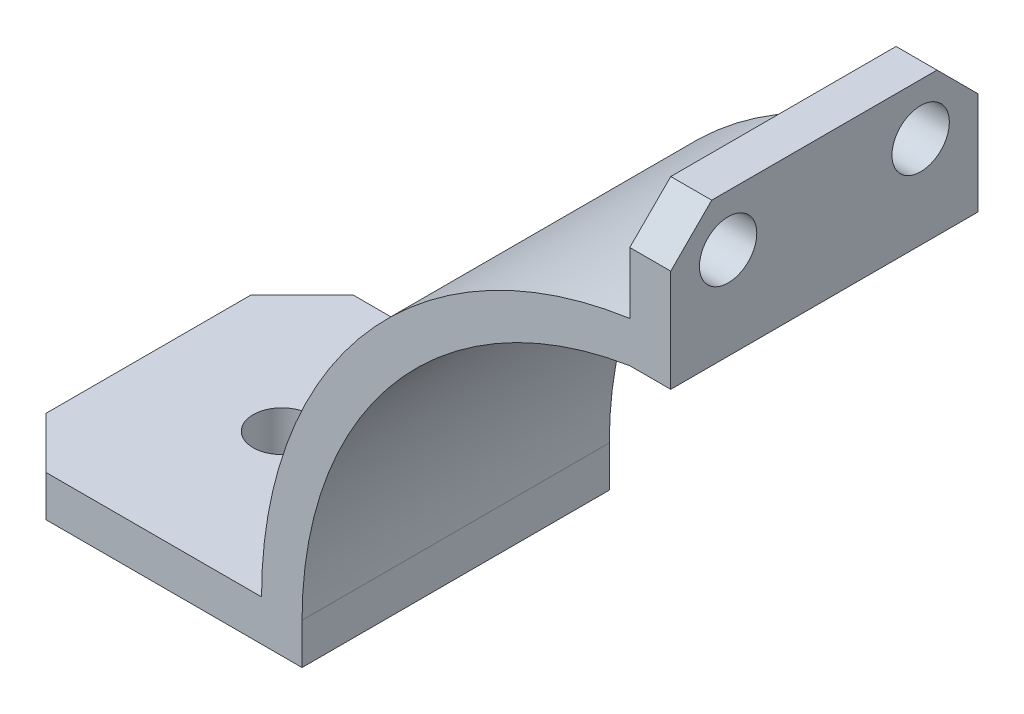
ISO-10303-21;
HEADER;
FILE_DESCRIPTION(('STEP AP214'),'2;1');
FILE_NAME('part.step','',(''),(''),'','','');
FILE_SCHEMA(('AUTOMOTIVE_DESIGN { 1 0 10303 214 1 1 1 1 }'));
ENDSEC;
DATA;
#1=APPLICATION_CONTEXT('core data for automotive mechanical design processes');
#2=APPLICATION_PROTOCOL_DEFINITION('international standard','automotive_design',2000,#1);
#3=PRODUCT_CONTEXT('',#1,'mechanical');
#4=PRODUCT('Part','Part','',(#3));
#5=PRODUCT_RELATED_PRODUCT_CATEGORY('part','',(#4));
#6=PRODUCT_DEFINITION_FORMATION('','',#4);
#7=PRODUCT_DEFINITION_CONTEXT('part definition',#1,'design');
#8=PRODUCT_DEFINITION('design','',#6,#7);
#9=PRODUCT_DEFINITION_SHAPE('','',#8);
#10=(LENGTH_UNIT() NAMED_UNIT(*) SI_UNIT(.MILLI.,.METRE.));
#11=(NAMED_UNIT(*) PLANE_ANGLE_UNIT() SI_UNIT($,.RADIAN.));
#12=(NAMED_UNIT(*) SI_UNIT($,.STERADIAN.) SOLID_ANGLE_UNIT());
#13=UNCERTAINTY_MEASURE_WITH_UNIT(LENGTH_MEASURE(1.E-05),#10,'distance_accuracy_value','');
#14=(GEOMETRIC_REPRESENTATION_CONTEXT(3) GLOBAL_UNCERTAINTY_ASSIGNED_CONTEXT((#13)) GLOBAL_UNIT_ASSIGNED_CONTEXT((#10,
#11,#12)) REPRESENTATION_CONTEXT('',''));
#15=CARTESIAN_POINT('',(0.,0.,0.));
#16=DIRECTION('',(0.,0.,1.));
#17=DIRECTION('',(1.,0.,0.));
#18=AXIS2_PLACEMENT_3D('',#15,#16,#17);
#19=CARTESIAN_POINT('',(0.,0.,15.));
#20=DIRECTION('',(0.,0.,-1.));
#21=DIRECTION('',(-1.,0.,0.));
#22=AXIS2_PLACEMENT_3D('',#19,#20,#21);
#23=CYLINDRICAL_SURFACE('',#22,19.);
#24=CARTESIAN_POINT('',(0.,0.,0.));
#25=DIRECTION('',(0.,0.,-1.));
#26=DIRECTION('',(-1.,0.,0.));
#27=AXIS2_PLACEMENT_3D('',#24,#25,#26);
#28=CIRCLE('',#27,19.);
#29=CARTESIAN_POINT('',(-19.,0.,0.));
#30=VERTEX_POINT('',#29);
#31=CARTESIAN_POINT('',(-3.,18.7616630392937,0.));
#32=VERTEX_POINT('',#31);
#33=EDGE_CURVE('E172',#30,#32,#28,.T.);
#34=ORIENTED_EDGE('',*,*,#33,.T.);
#35=DIRECTION('',(0.,0.,-1.));
#36=VECTOR('',#35,1.);
#37=CARTESIAN_POINT('',(-3.,18.7616630392937,15.));
#38=LINE('',#37,#36);
#39=CARTESIAN_POINT('',(-3.,18.7616630392937,15.));
#40=VERTEX_POINT('',#39);
#41=EDGE_CURVE('E152',#40,#32,#38,.T.);
#42=ORIENTED_EDGE('',*,*,#41,.F.);
#43=CARTESIAN_POINT('',(0.,0.,15.));
#44=DIRECTION('',(0.,0.,-1.));
#45=DIRECTION('',(-1.,0.,0.));
#46=AXIS2_PLACEMENT_3D('',#43,#44,#45);
#47=CIRCLE('',#46,19.);
#48=CARTESIAN_POINT('',(-19.,0.,15.));
#49=VERTEX_POINT('',#48);
#50=EDGE_CURVE('E160',#49,#40,#47,.T.);
#51=ORIENTED_EDGE('',*,*,#50,.F.);
#52=DIRECTION('',(0.,0.,-1.));
#53=VECTOR('',#52,1.);
#54=CARTESIAN_POINT('',(-19.,0.,15.));
#55=LINE('',#54,#53);
#56=EDGE_CURVE('E243',#49,#30,#55,.T.);
#57=ORIENTED_EDGE('',*,*,#56,.T.);
#58=EDGE_LOOP('',(#34,#42,#51,#57));
#59=FACE_BOUND('',#58,.T.);
#60=ADVANCED_FACE('F45',(#59),#23,.F.);
#61=CARTESIAN_POINT('',(-1.,18.7616630392937,15.));
#62=DIRECTION('',(0.,1.,0.));
#63=DIRECTION('',(0.,0.,1.));
#64=AXIS2_PLACEMENT_3D('',#61,#62,#63);
#65=PLANE('',#64);
#66=DIRECTION('',(1.,0.,0.));
#67=VECTOR('',#66,1.);
#68=CARTESIAN_POINT('',(-1.,18.7616630392937,0.));
#69=LINE('',#68,#67);
#70=CARTESIAN_POINT('',(-1.,18.7616630392937,0.));
#71=VERTEX_POINT('',#70);
#72=EDGE_CURVE('E257',#32,#71,#69,.T.);
#73=ORIENTED_EDGE('',*,*,#72,.T.);
#74=DIRECTION('',(0.,0.,-1.));
#75=VECTOR('',#74,1.);
#76=CARTESIAN_POINT('',(-1.,18.7616630392937,15.));
#77=LINE('',#76,#75);
#78=CARTESIAN_POINT('',(-1.,18.7616630392937,15.));
#79=VERTEX_POINT('',#78);
#80=EDGE_CURVE('E155',#79,#71,#77,.T.);
#81=ORIENTED_EDGE('',*,*,#80,.F.);
#82=DIRECTION('',(1.,0.,0.));
#83=VECTOR('',#82,1.);
#84=CARTESIAN_POINT('',(-1.,18.7616630392937,15.));
#85=LINE('',#84,#83);
#86=EDGE_CURVE('E148',#40,#79,#85,.T.);
#87=ORIENTED_EDGE('',*,*,#86,.F.);
#88=ORIENTED_EDGE('',*,*,#41,.T.);
#89=EDGE_LOOP('',(#73,#81,#87,#88));
#90=FACE_BOUND('',#89,.T.);
#91=ADVANCED_FACE('F150',(#90),#65,.F.);
#92=CARTESIAN_POINT('',(-1.,25.7616630392937,15.));
#93=DIRECTION('',(-1.,0.,0.));
#94=DIRECTION('',(0.,-1.,0.));
#95=AXIS2_PLACEMENT_3D('',#92,#93,#94);
#96=PLANE('',#95);
#97=CARTESIAN_POINT('',(-1.,23.2616630392937,2.8));
#98=DIRECTION('',(-1.,0.,0.));
#99=DIRECTION('',(0.,-1.,0.));
#100=AXIS2_PLACEMENT_3D('',#97,#98,#99);
#101=CIRCLE('',#100,1.4);
#102=CARTESIAN_POINT('',(-1.,21.8616630392937,2.8));
#103=VERTEX_POINT('',#102);
#104=EDGE_CURVE('E260',#103,#103,#101,.T.);
#105=ORIENTED_EDGE('',*,*,#104,.T.);
#106=EDGE_LOOP('',(#105));
#107=FACE_BOUND('',#106,.T.);
#108=CARTESIAN_POINT('',(-1.,23.2616630392937,12.2));
#109=DIRECTION('',(-1.,0.,0.));
#110=DIRECTION('',(0.,-1.,0.));
#111=AXIS2_PLACEMENT_3D('',#108,#109,#110);
#112=CIRCLE('',#111,1.4);
#113=CARTESIAN_POINT('',(-1.,21.8616630392937,12.2));
#114=VERTEX_POINT('',#113);
#115=EDGE_CURVE('E272',#114,#114,#112,.T.);
#116=ORIENTED_EDGE('',*,*,#115,.T.);
#117=EDGE_LOOP('',(#116));
#118=FACE_BOUND('',#117,.T.);
#119=DIRECTION('',(0.,0.,-1.));
#120=VECTOR('',#119,1.);
#121=CARTESIAN_POINT('',(-1.,25.7616630392937,15.));
#122=LINE('',#121,#120);
#123=CARTESIAN_POINT('',(-1.,25.7616630392937,13.));
#124=VERTEX_POINT('',#123);
#125=CARTESIAN_POINT('',(-1.,25.7616630392937,2.));
#126=VERTEX_POINT('',#125);
#127=EDGE_CURVE('E177',#124,#126,#122,.T.);
#128=ORIENTED_EDGE('',*,*,#127,.F.);
#129=DIRECTION('',(0.,0.707106781186546,-0.707106781186549));
#130=VECTOR('',#129,1.);
#131=CARTESIAN_POINT('',(-1.,23.7616630392937,15.));
#132=LINE('',#131,#130);
#133=CARTESIAN_POINT('',(-1.,23.7616630392937,15.));
#134=VERTEX_POINT('',#133);
#135=EDGE_CURVE('E54',#124,#134,#132,.F.);
#136=ORIENTED_EDGE('',*,*,#135,.T.);
#137=DIRECTION('',(0.,1.,0.));
#138=VECTOR('',#137,1.);
#139=CARTESIAN_POINT('',(-1.,25.7616630392937,15.));
#140=LINE('',#139,#138);
#141=EDGE_CURVE('E159',#79,#134,#140,.T.);
#142=ORIENTED_EDGE('',*,*,#141,.F.);
#143=ORIENTED_EDGE('',*,*,#80,.T.);
#144=DIRECTION('',(0.,1.,0.));
#145=VECTOR('',#144,1.);
#146=CARTESIAN_POINT('',(-1.,25.7616630392937,0.));
#147=LINE('',#146,#145);
#148=CARTESIAN_POINT('',(-1.,23.7616630392937,0.));
#149=VERTEX_POINT('',#148);
#150=EDGE_CURVE('E255',#71,#149,#147,.T.);
#151=ORIENTED_EDGE('',*,*,#150,.T.);
#152=DIRECTION('',(0.,0.707106781186549,0.707106781186546));
#153=VECTOR('',#152,1.);
#154=CARTESIAN_POINT('',(-1.,25.7616630392937,2.));
#155=LINE('',#154,#153);
#156=EDGE_CURVE('E66',#149,#126,#155,.T.);
#157=ORIENTED_EDGE('',*,*,#156,.T.);
#158=EDGE_LOOP('',(#128,#136,#142,#143,#151,#157));
#159=FACE_BOUND('',#158,.T.);
#160=ADVANCED_FACE('F209',(#107,#118,#159),#96,.F.);
#161=CARTESIAN_POINT('',(-3.,25.7616630392937,15.));
#162=DIRECTION('',(0.,-1.,0.));
#163=DIRECTION('',(0.,0.,-1.));
#164=AXIS2_PLACEMENT_3D('',#161,#162,#163);
#165=PLANE('',#164);
#166=DIRECTION('',(0.,0.,-1.));
#167=VECTOR('',#166,1.);
#168=CARTESIAN_POINT('',(-3.,25.7616630392937,15.));
#169=LINE('',#168,#167);
#170=CARTESIAN_POINT('',(-3.,25.7616630392937,13.));
#171=VERTEX_POINT('',#170);
#172=CARTESIAN_POINT('',(-3.,25.7616630392937,2.));
#173=VERTEX_POINT('',#172);
#174=EDGE_CURVE('E221',#171,#173,#169,.T.);
#175=ORIENTED_EDGE('',*,*,#174,.F.);
#176=DIRECTION('',(1.,0.,0.));
#177=VECTOR('',#176,1.);
#178=CARTESIAN_POINT('',(-3.,25.7616630392937,13.));
#179=LINE('',#178,#177);
#180=EDGE_CURVE('E206',#171,#124,#179,.T.);
#181=ORIENTED_EDGE('',*,*,#180,.T.);
#182=ORIENTED_EDGE('',*,*,#127,.T.);
#183=DIRECTION('',(-1.,0.,0.));
#184=VECTOR('',#183,1.);
#185=CARTESIAN_POINT('',(-3.,25.7616630392937,2.));
#186=LINE('',#185,#184);
#187=EDGE_CURVE('E203',#126,#173,#186,.T.);
#188=ORIENTED_EDGE('',*,*,#187,.T.);
#189=EDGE_LOOP('',(#175,#181,#182,#188));
#190=FACE_BOUND('',#189,.T.);
#191=ADVANCED_FACE('F224',(#190),#165,.F.);
#192=CARTESIAN_POINT('',(-3.,20.7616630392937,15.));
#193=DIRECTION('',(1.,0.,0.));
#194=DIRECTION('',(0.,1.,0.));
#195=AXIS2_PLACEMENT_3D('',#192,#193,#194);
#196=PLANE('',#195);
#197=CARTESIAN_POINT('',(-3.,23.2616630392937,2.8));
#198=DIRECTION('',(-1.,0.,0.));
#199=DIRECTION('',(0.,-1.,0.));
#200=AXIS2_PLACEMENT_3D('',#197,#198,#199);
#201=CIRCLE('',#200,1.4);
#202=CARTESIAN_POINT('',(-3.,21.8616630392937,2.8));
#203=VERTEX_POINT('',#202);
#204=EDGE_CURVE('E275',#203,#203,#201,.T.);
#205=ORIENTED_EDGE('',*,*,#204,.F.);
#206=EDGE_LOOP('',(#205));
#207=FACE_BOUND('',#206,.T.);
#208=CARTESIAN_POINT('',(-3.,23.2616630392937,12.2));
#209=DIRECTION('',(-1.,0.,0.));
#210=DIRECTION('',(0.,-1.,0.));
#211=AXIS2_PLACEMENT_3D('',#208,#209,#210);
#212=CIRCLE('',#211,1.4);
#213=CARTESIAN_POINT('',(-3.,21.8616630392937,12.2));
#214=VERTEX_POINT('',#213);
#215=EDGE_CURVE('E276',#214,#214,#212,.T.);
#216=ORIENTED_EDGE('',*,*,#215,.F.);
#217=EDGE_LOOP('',(#216));
#218=FACE_BOUND('',#217,.T.);
#219=DIRECTION('',(0.,-1.,0.));
#220=VECTOR('',#219,1.);
#221=CARTESIAN_POINT('',(-3.,20.7616630392937,15.));
#222=LINE('',#221,#220);
#223=CARTESIAN_POINT('',(-3.,23.7616630392937,15.));
#224=VERTEX_POINT('',#223);
#225=CARTESIAN_POINT('',(-3.,20.7616630392937,15.));
#226=VERTEX_POINT('',#225);
#227=EDGE_CURVE('E214',#224,#226,#222,.T.);
#228=ORIENTED_EDGE('',*,*,#227,.F.);
#229=DIRECTION('',(0.,-0.707106781186546,0.707106781186549));
#230=VECTOR('',#229,1.);
#231=CARTESIAN_POINT('',(-3.,23.7616630392937,15.));
#232=LINE('',#231,#230);
#233=EDGE_CURVE('E201',#224,#171,#232,.F.);
#234=ORIENTED_EDGE('',*,*,#233,.T.);
#235=ORIENTED_EDGE('',*,*,#174,.T.);
#236=DIRECTION('',(0.,-0.707106781186549,-0.707106781186546));
#237=VECTOR('',#236,1.);
#238=CARTESIAN_POINT('',(-3.,25.7616630392937,2.));
#239=LINE('',#238,#237);
#240=CARTESIAN_POINT('',(-3.,23.7616630392937,0.));
#241=VERTEX_POINT('',#240);
#242=EDGE_CURVE('E199',#173,#241,#239,.T.);
#243=ORIENTED_EDGE('',*,*,#242,.T.);
#244=DIRECTION('',(0.,-1.,0.));
#245=VECTOR('',#244,1.);
#246=CARTESIAN_POINT('',(-3.,20.7616630392937,0.));
#247=LINE('',#246,#245);
#248=CARTESIAN_POINT('',(-3.,20.7616630392937,0.));
#249=VERTEX_POINT('',#248);
#250=EDGE_CURVE('E253',#241,#249,#247,.T.);
#251=ORIENTED_EDGE('',*,*,#250,.T.);
#252=DIRECTION('',(0.,0.,-1.));
#253=VECTOR('',#252,1.);
#254=CARTESIAN_POINT('',(-3.,20.7616630392937,15.));
#255=LINE('',#254,#253);
#256=EDGE_CURVE('E226',#226,#249,#255,.T.);
#257=ORIENTED_EDGE('',*,*,#256,.F.);
#258=EDGE_LOOP('',(#228,#234,#235,#243,#251,#257));
#259=FACE_BOUND('',#258,.T.);
#260=ADVANCED_FACE('F220',(#207,#218,#259),#196,.F.);
#261=CARTESIAN_POINT('',(0.,0.,15.));
#262=DIRECTION('',(0.,0.,-1.));
#263=DIRECTION('',(-1.,0.,0.));
#264=AXIS2_PLACEMENT_3D('',#261,#262,#263);
#265=CYLINDRICAL_SURFACE('',#264,20.9772889610925);
#266=CARTESIAN_POINT('',(0.,0.,0.));
#267=DIRECTION('',(0.,0.,1.));
#268=DIRECTION('',(-1.,0.,0.));
#269=AXIS2_PLACEMENT_3D('',#266,#267,#268);
#270=CIRCLE('',#269,20.9772889610925);
#271=CARTESIAN_POINT('',(-20.9772889610925,0.,0.));
#272=VERTEX_POINT('',#271);
#273=EDGE_CURVE('E251',#249,#272,#270,.T.);
#274=ORIENTED_EDGE('',*,*,#273,.T.);
#275=DIRECTION('',(0.,0.,-1.));
#276=VECTOR('',#275,1.);
#277=CARTESIAN_POINT('',(-20.9772889610925,0.,15.));
#278=LINE('',#277,#276);
#279=CARTESIAN_POINT('',(-20.9772889610925,0.,15.));
#280=VERTEX_POINT('',#279);
#281=EDGE_CURVE('E229',#280,#272,#278,.T.);
#282=ORIENTED_EDGE('',*,*,#281,.F.);
#283=CARTESIAN_POINT('',(0.,0.,15.));
#284=DIRECTION('',(0.,0.,1.));
#285=DIRECTION('',(-1.,0.,0.));
#286=AXIS2_PLACEMENT_3D('',#283,#284,#285);
#287=CIRCLE('',#286,20.9772889610925);
#288=EDGE_CURVE('E267',#226,#280,#287,.T.);
#289=ORIENTED_EDGE('',*,*,#288,.F.);
#290=ORIENTED_EDGE('',*,*,#256,.T.);
#291=EDGE_LOOP('',(#274,#282,#289,#290));
#292=FACE_BOUND('',#291,.T.);
#293=ADVANCED_FACE('F301',(#292),#265,.T.);
#294=CARTESIAN_POINT('',(-34.,0.,15.));
#295=DIRECTION('',(0.,-1.,0.));
#296=DIRECTION('',(0.,0.,-1.));
#297=AXIS2_PLACEMENT_3D('',#294,#295,#296);
#298=PLANE('',#297);
#299=CARTESIAN_POINT('',(-27.4886444805463,0.,7.5));
#300=DIRECTION('',(0.,1.,0.));
#301=DIRECTION('',(0.,0.,1.));
#302=AXIS2_PLACEMENT_3D('',#299,#300,#301);
#303=CIRCLE('',#302,1.4);
#304=CARTESIAN_POINT('',(-27.4886444805463,0.,8.9));
#305=VERTEX_POINT('',#304);
#306=EDGE_CURVE('E282',#305,#305,#303,.T.);
#307=ORIENTED_EDGE('',*,*,#306,.F.);
#308=EDGE_LOOP('',(#307));
#309=FACE_BOUND('',#308,.T.);
#310=DIRECTION('',(-1.,0.,0.));
#311=VECTOR('',#310,1.);
#312=CARTESIAN_POINT('',(-34.,0.,0.));
#313=LINE('',#312,#311);
#314=CARTESIAN_POINT('',(-31.5,0.,0.));
#315=VERTEX_POINT('',#314);
#316=EDGE_CURVE('E248',#272,#315,#313,.T.);
#317=ORIENTED_EDGE('',*,*,#316,.T.);
#318=DIRECTION('',(-0.707106781186549,0.,0.707106781186547));
#319=VECTOR('',#318,1.);
#320=CARTESIAN_POINT('',(-34.,0.,2.5));
#321=LINE('',#320,#319);
#322=CARTESIAN_POINT('',(-34.,0.,2.5));
#323=VERTEX_POINT('',#322);
#324=EDGE_CURVE('E191',#315,#323,#321,.T.);
#325=ORIENTED_EDGE('',*,*,#324,.T.);
#326=DIRECTION('',(0.,0.,-1.));
#327=VECTOR('',#326,1.);
#328=CARTESIAN_POINT('',(-34.,0.,15.));
#329=LINE('',#328,#327);
#330=CARTESIAN_POINT('',(-34.,0.,12.5));
#331=VERTEX_POINT('',#330);
#332=EDGE_CURVE('E234',#331,#323,#329,.T.);
#333=ORIENTED_EDGE('',*,*,#332,.F.);
#334=DIRECTION('',(-0.707106781186548,0.,-0.707106781186548));
#335=VECTOR('',#334,1.);
#336=CARTESIAN_POINT('',(-31.5,0.,15.));
#337=LINE('',#336,#335);
#338=CARTESIAN_POINT('',(-31.5,0.,15.));
#339=VERTEX_POINT('',#338);
#340=EDGE_CURVE('E189',#331,#339,#337,.F.);
#341=ORIENTED_EDGE('',*,*,#340,.T.);
#342=DIRECTION('',(-1.,0.,0.));
#343=VECTOR('',#342,1.);
#344=CARTESIAN_POINT('',(-34.,0.,15.));
#345=LINE('',#344,#343);
#346=EDGE_CURVE('E264',#280,#339,#345,.T.);
#347=ORIENTED_EDGE('',*,*,#346,.F.);
#348=ORIENTED_EDGE('',*,*,#281,.T.);
#349=EDGE_LOOP('',(#317,#325,#333,#341,#347,#348));
#350=FACE_BOUND('',#349,.T.);
#351=ADVANCED_FACE('F297',(#309,#350),#298,.F.);
#352=CARTESIAN_POINT('',(-34.,-2.,15.));
#353=DIRECTION('',(1.,0.,0.));
#354=DIRECTION('',(0.,0.,-1.));
#355=AXIS2_PLACEMENT_3D('',#352,#353,#354);
#356=PLANE('',#355);
#357=ORIENTED_EDGE('',*,*,#332,.T.);
#358=DIRECTION('',(0.,-1.,0.));
#359=VECTOR('',#358,1.);
#360=CARTESIAN_POINT('',(-34.,-2.,2.5));
#361=LINE('',#360,#359);
#362=CARTESIAN_POINT('',(-34.,-2.,2.5));
#363=VERTEX_POINT('',#362);
#364=EDGE_CURVE('E175',#323,#363,#361,.T.);
#365=ORIENTED_EDGE('',*,*,#364,.T.);
#366=DIRECTION('',(0.,0.,-1.));
#367=VECTOR('',#366,1.);
#368=CARTESIAN_POINT('',(-34.,-2.,15.));
#369=LINE('',#368,#367);
#370=CARTESIAN_POINT('',(-34.,-2.,12.5));
#371=VERTEX_POINT('',#370);
#372=EDGE_CURVE('E237',#371,#363,#369,.T.);
#373=ORIENTED_EDGE('',*,*,#372,.F.);
#374=DIRECTION('',(0.,1.,0.));
#375=VECTOR('',#374,1.);
#376=CARTESIAN_POINT('',(-34.,-2.,12.5));
#377=LINE('',#376,#375);
#378=EDGE_CURVE('E173',#371,#331,#377,.T.);
#379=ORIENTED_EDGE('',*,*,#378,.T.);
#380=EDGE_LOOP('',(#357,#365,#373,#379));
#381=FACE_BOUND('',#380,.T.);
#382=ADVANCED_FACE('F300',(#381),#356,.F.);
#383=CARTESIAN_POINT('',(-19.,-2.,15.));
#384=DIRECTION('',(0.,1.,0.));
#385=DIRECTION('',(-1.,0.,0.));
#386=AXIS2_PLACEMENT_3D('',#383,#384,#385);
#387=PLANE('',#386);
#388=CARTESIAN_POINT('',(-27.4886444805463,-2.,7.5));
#389=DIRECTION('',(0.,1.,0.));
#390=DIRECTION('',(0.,0.,1.));
#391=AXIS2_PLACEMENT_3D('',#388,#389,#390);
#392=CIRCLE('',#391,1.4);
#393=CARTESIAN_POINT('',(-27.4886444805463,-2.,8.9));
#394=VERTEX_POINT('',#393);
#395=EDGE_CURVE('E279',#394,#394,#392,.T.);
#396=ORIENTED_EDGE('',*,*,#395,.T.);
#397=EDGE_LOOP('',(#396));
#398=FACE_BOUND('',#397,.T.);
#399=ORIENTED_EDGE('',*,*,#372,.T.);
#400=DIRECTION('',(0.707106781186549,0.,-0.707106781186547));
#401=VECTOR('',#400,1.);
#402=CARTESIAN_POINT('',(-34.,-2.,2.5));
#403=LINE('',#402,#401);
#404=CARTESIAN_POINT('',(-31.5,-2.,0.));
#405=VERTEX_POINT('',#404);
#406=EDGE_CURVE('E185',#363,#405,#403,.T.);
#407=ORIENTED_EDGE('',*,*,#406,.T.);
#408=DIRECTION('',(1.,0.,0.));
#409=VECTOR('',#408,1.);
#410=CARTESIAN_POINT('',(-19.,-2.,0.));
#411=LINE('',#410,#409);
#412=CARTESIAN_POINT('',(-19.,-2.,0.));
#413=VERTEX_POINT('',#412);
#414=EDGE_CURVE('E246',#405,#413,#411,.T.);
#415=ORIENTED_EDGE('',*,*,#414,.T.);
#416=DIRECTION('',(0.,0.,-1.));
#417=VECTOR('',#416,1.);
#418=CARTESIAN_POINT('',(-19.,-2.,15.));
#419=LINE('',#418,#417);
#420=CARTESIAN_POINT('',(-19.,-2.,15.));
#421=VERTEX_POINT('',#420);
#422=EDGE_CURVE('E240',#421,#413,#419,.T.);
#423=ORIENTED_EDGE('',*,*,#422,.F.);
#424=DIRECTION('',(1.,0.,0.));
#425=VECTOR('',#424,1.);
#426=CARTESIAN_POINT('',(-19.,-2.,15.));
#427=LINE('',#426,#425);
#428=CARTESIAN_POINT('',(-31.5,-2.,15.));
#429=VERTEX_POINT('',#428);
#430=EDGE_CURVE('E262',#429,#421,#427,.T.);
#431=ORIENTED_EDGE('',*,*,#430,.F.);
#432=DIRECTION('',(0.707106781186548,0.,0.707106781186548));
#433=VECTOR('',#432,1.);
#434=CARTESIAN_POINT('',(-31.5,-2.,15.));
#435=LINE('',#434,#433);
#436=EDGE_CURVE('E183',#429,#371,#435,.F.);
#437=ORIENTED_EDGE('',*,*,#436,.T.);
#438=EDGE_LOOP('',(#399,#407,#415,#423,#431,#437));
#439=FACE_BOUND('',#438,.T.);
#440=ADVANCED_FACE('F288',(#398,#439),#387,.F.);
#441=CARTESIAN_POINT('',(-19.,0.,15.));
#442=DIRECTION('',(-1.,0.,0.));
#443=DIRECTION('',(0.,0.,1.));
#444=AXIS2_PLACEMENT_3D('',#441,#442,#443);
#445=PLANE('',#444);
#446=DIRECTION('',(0.,1.,0.));
#447=VECTOR('',#446,1.);
#448=CARTESIAN_POINT('',(-19.,0.,0.));
#449=LINE('',#448,#447);
#450=EDGE_CURVE('E169',#413,#30,#449,.T.);
#451=ORIENTED_EDGE('',*,*,#450,.T.);
#452=ORIENTED_EDGE('',*,*,#56,.F.);
#453=DIRECTION('',(0.,1.,0.));
#454=VECTOR('',#453,1.);
#455=CARTESIAN_POINT('',(-19.,0.,15.));
#456=LINE('',#455,#454);
#457=EDGE_CURVE('E165',#421,#49,#456,.T.);
#458=ORIENTED_EDGE('',*,*,#457,.F.);
#459=ORIENTED_EDGE('',*,*,#422,.T.);
#460=EDGE_LOOP('',(#451,#452,#458,#459));
#461=FACE_BOUND('',#460,.T.);
#462=ADVANCED_FACE('F369',(#461),#445,.F.);
#463=CARTESIAN_POINT('',(0.,0.,15.));
#464=DIRECTION('',(0.,0.,-1.));
#465=DIRECTION('',(-1.,0.,0.));
#466=AXIS2_PLACEMENT_3D('',#463,#464,#465);
#467=PLANE('',#466);
#468=ORIENTED_EDGE('',*,*,#141,.T.);
#469=DIRECTION('',(-1.,0.,0.));
#470=VECTOR('',#469,1.);
#471=CARTESIAN_POINT('',(0.,23.7616630392937,15.));
#472=LINE('',#471,#470);
#473=EDGE_CURVE('E196',#134,#224,#472,.T.);
#474=ORIENTED_EDGE('',*,*,#473,.T.);
#475=ORIENTED_EDGE('',*,*,#227,.T.);
#476=ORIENTED_EDGE('',*,*,#288,.T.);
#477=ORIENTED_EDGE('',*,*,#346,.T.);
#478=DIRECTION('',(0.,-1.,0.));
#479=VECTOR('',#478,1.);
#480=CARTESIAN_POINT('',(-31.5,0.,15.));
#481=LINE('',#480,#479);
#482=EDGE_CURVE('E193',#339,#429,#481,.T.);
#483=ORIENTED_EDGE('',*,*,#482,.T.);
#484=ORIENTED_EDGE('',*,*,#430,.T.);
#485=ORIENTED_EDGE('',*,*,#457,.T.);
#486=ORIENTED_EDGE('',*,*,#50,.T.);
#487=ORIENTED_EDGE('',*,*,#86,.T.);
#488=EDGE_LOOP('',(#468,#474,#475,#476,#477,#483,#484,#485,#486,#487));
#489=FACE_BOUND('',#488,.T.);
#490=ADVANCED_FACE('F163',(#489),#467,.F.);
#491=CARTESIAN_POINT('',(0.,0.,0.));
#492=DIRECTION('',(0.,0.,-1.));
#493=DIRECTION('',(-1.,0.,0.));
#494=AXIS2_PLACEMENT_3D('',#491,#492,#493);
#495=PLANE('',#494);
#496=ORIENTED_EDGE('',*,*,#250,.F.);
#497=DIRECTION('',(1.,0.,0.));
#498=VECTOR('',#497,1.);
#499=CARTESIAN_POINT('',(-1.,23.7616630392937,0.));
#500=LINE('',#499,#498);
#501=EDGE_CURVE('E11',#241,#149,#500,.T.);
#502=ORIENTED_EDGE('',*,*,#501,.T.);
#503=ORIENTED_EDGE('',*,*,#150,.F.);
#504=ORIENTED_EDGE('',*,*,#72,.F.);
#505=ORIENTED_EDGE('',*,*,#33,.F.);
#506=ORIENTED_EDGE('',*,*,#450,.F.);
#507=ORIENTED_EDGE('',*,*,#414,.F.);
#508=DIRECTION('',(0.,1.,0.));
#509=VECTOR('',#508,1.);
#510=CARTESIAN_POINT('',(-31.5,0.,0.));
#511=LINE('',#510,#509);
#512=EDGE_CURVE('E187',#405,#315,#511,.T.);
#513=ORIENTED_EDGE('',*,*,#512,.T.);
#514=ORIENTED_EDGE('',*,*,#316,.F.);
#515=ORIENTED_EDGE('',*,*,#273,.F.);
#516=EDGE_LOOP('',(#496,#502,#503,#504,#505,#506,#507,#513,#514,#515));
#517=FACE_BOUND('',#516,.T.);
#518=ADVANCED_FACE('F325',(#517),#495,.T.);
#519=CARTESIAN_POINT('',(-34.,-2.,2.5));
#520=DIRECTION('',(-0.707106781186547,0.,-0.707106781186549));
#521=DIRECTION('',(0.,1.,0.));
#522=AXIS2_PLACEMENT_3D('',#519,#520,#521);
#523=PLANE('',#522);
#524=ORIENTED_EDGE('',*,*,#324,.F.);
#525=ORIENTED_EDGE('',*,*,#512,.F.);
#526=ORIENTED_EDGE('',*,*,#406,.F.);
#527=ORIENTED_EDGE('',*,*,#364,.F.);
#528=EDGE_LOOP('',(#524,#525,#526,#527));
#529=FACE_BOUND('',#528,.T.);
#530=ADVANCED_FACE('F312',(#529),#523,.T.);
#531=CARTESIAN_POINT('',(-31.5,0.,15.));
#532=DIRECTION('',(0.707106781186547,0.,-0.707106781186547));
#533=DIRECTION('',(0.,-1.,0.));
#534=AXIS2_PLACEMENT_3D('',#531,#532,#533);
#535=PLANE('',#534);
#536=ORIENTED_EDGE('',*,*,#340,.F.);
#537=ORIENTED_EDGE('',*,*,#378,.F.);
#538=ORIENTED_EDGE('',*,*,#436,.F.);
#539=ORIENTED_EDGE('',*,*,#482,.F.);
#540=EDGE_LOOP('',(#536,#537,#538,#539));
#541=FACE_BOUND('',#540,.T.);
#542=ADVANCED_FACE('F322',(#541),#535,.F.);
#543=CARTESIAN_POINT('',(12.,23.2616630392937,12.2));
#544=DIRECTION('',(-1.,0.,0.));
#545=DIRECTION('',(0.,-1.,0.));
#546=AXIS2_PLACEMENT_3D('',#543,#544,#545);
#547=CYLINDRICAL_SURFACE('',#546,1.4);
#548=ORIENTED_EDGE('',*,*,#215,.T.);
#549=EDGE_LOOP('',(#548));
#550=FACE_BOUND('',#549,.T.);
#551=ORIENTED_EDGE('',*,*,#115,.F.);
#552=EDGE_LOOP('',(#551));
#553=FACE_BOUND('',#552,.T.);
#554=ADVANCED_FACE('F350',(#550,#553),#547,.F.);
#555=CARTESIAN_POINT('',(12.,23.2616630392937,2.8));
#556=DIRECTION('',(-1.,0.,0.));
#557=DIRECTION('',(0.,-1.,0.));
#558=AXIS2_PLACEMENT_3D('',#555,#556,#557);
#559=CYLINDRICAL_SURFACE('',#558,1.4);
#560=ORIENTED_EDGE('',*,*,#204,.T.);
#561=EDGE_LOOP('',(#560));
#562=FACE_BOUND('',#561,.T.);
#563=ORIENTED_EDGE('',*,*,#104,.F.);
#564=EDGE_LOOP('',(#563));
#565=FACE_BOUND('',#564,.T.);
#566=ADVANCED_FACE('F331',(#562,#565),#559,.F.);
#567=CARTESIAN_POINT('',(0.,23.7616630392937,15.));
#568=DIRECTION('',(0.,-0.707106781186549,-0.707106781186546));
#569=DIRECTION('',(-1.,0.,0.));
#570=AXIS2_PLACEMENT_3D('',#567,#568,#569);
#571=PLANE('',#570);
#572=ORIENTED_EDGE('',*,*,#135,.F.);
#573=ORIENTED_EDGE('',*,*,#180,.F.);
#574=ORIENTED_EDGE('',*,*,#233,.F.);
#575=ORIENTED_EDGE('',*,*,#473,.F.);
#576=EDGE_LOOP('',(#572,#573,#574,#575));
#577=FACE_BOUND('',#576,.T.);
#578=ADVANCED_FACE('F216',(#577),#571,.F.);
#579=CARTESIAN_POINT('',(-3.,25.7616630392937,2.));
#580=DIRECTION('',(0.,0.707106781186546,-0.707106781186549));
#581=DIRECTION('',(1.,0.,0.));
#582=AXIS2_PLACEMENT_3D('',#579,#580,#581);
#583=PLANE('',#582);
#584=ORIENTED_EDGE('',*,*,#156,.F.);
#585=ORIENTED_EDGE('',*,*,#501,.F.);
#586=ORIENTED_EDGE('',*,*,#242,.F.);
#587=ORIENTED_EDGE('',*,*,#187,.F.);
#588=EDGE_LOOP('',(#584,#585,#586,#587));
#589=FACE_BOUND('',#588,.T.);
#590=ADVANCED_FACE('F48',(#589),#583,.T.);
#591=CARTESIAN_POINT('',(-27.4886444805463,-2.,7.5));
#592=DIRECTION('',(0.,1.,0.));
#593=DIRECTION('',(0.,0.,1.));
#594=AXIS2_PLACEMENT_3D('',#591,#592,#593);
#595=CYLINDRICAL_SURFACE('',#594,1.4);
#596=ORIENTED_EDGE('',*,*,#395,.F.);
#597=EDGE_LOOP('',(#596));
#598=FACE_BOUND('',#597,.T.);
#599=ORIENTED_EDGE('',*,*,#306,.T.);
#600=EDGE_LOOP('',(#599));
#601=FACE_BOUND('',#600,.T.);
#602=ADVANCED_FACE('F291',(#598,#601),#595,.F.);
#603=CLOSED_SHELL('',(#60,#91,#160,#191,#260,#293,#351,#382,#440,#462,#490,#518,#530,#542,#554,
#566,#578,#590,#602));
#604=MANIFOLD_SOLID_BREP('B2',#603);
#605=ADVANCED_BREP_SHAPE_REPRESENTATION('',(#18,#604),#14);
#606=SHAPE_DEFINITION_REPRESENTATION(#9,#605);
ENDSEC;
END-ISO-10303-21;
